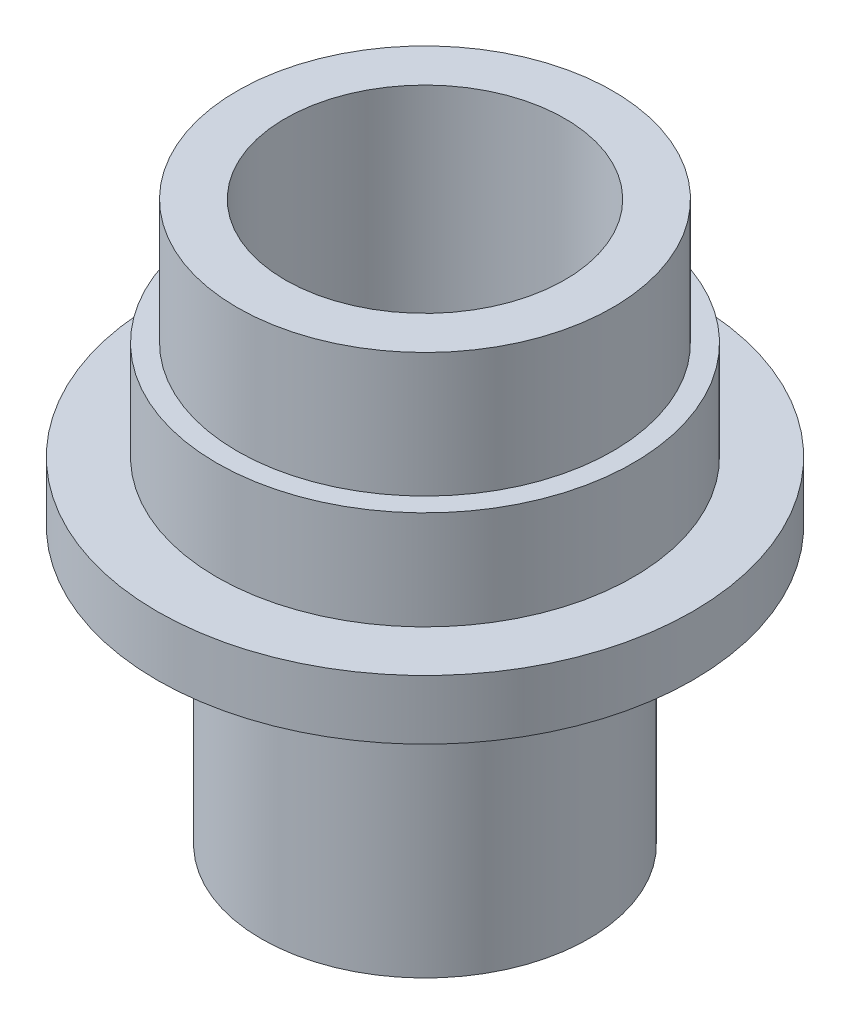
ISO-10303-21;
HEADER;
FILE_DESCRIPTION(('STEP AP214'),'2;1');
FILE_NAME('part.step','',(''),(''),'','','');
FILE_SCHEMA(('AUTOMOTIVE_DESIGN { 1 0 10303 214 1 1 1 1 }'));
ENDSEC;
DATA;
#1=APPLICATION_CONTEXT('core data for automotive mechanical design processes');
#2=APPLICATION_PROTOCOL_DEFINITION('international standard','automotive_design',2000,#1);
#3=PRODUCT_CONTEXT('',#1,'mechanical');
#4=PRODUCT('Part','Part','',(#3));
#5=PRODUCT_RELATED_PRODUCT_CATEGORY('part','',(#4));
#6=PRODUCT_DEFINITION_FORMATION('','',#4);
#7=PRODUCT_DEFINITION_CONTEXT('part definition',#1,'design');
#8=PRODUCT_DEFINITION('design','',#6,#7);
#9=PRODUCT_DEFINITION_SHAPE('','',#8);
#10=(LENGTH_UNIT() NAMED_UNIT(*) SI_UNIT(.MILLI.,.METRE.));
#11=(NAMED_UNIT(*) PLANE_ANGLE_UNIT() SI_UNIT($,.RADIAN.));
#12=(NAMED_UNIT(*) SI_UNIT($,.STERADIAN.) SOLID_ANGLE_UNIT());
#13=UNCERTAINTY_MEASURE_WITH_UNIT(LENGTH_MEASURE(1.E-05),#10,'distance_accuracy_value','');
#14=(GEOMETRIC_REPRESENTATION_CONTEXT(3) GLOBAL_UNCERTAINTY_ASSIGNED_CONTEXT((#13)) GLOBAL_UNIT_ASSIGNED_CONTEXT((#10,
#11,#12)) REPRESENTATION_CONTEXT('',''));
#15=CARTESIAN_POINT('',(0.,0.,0.));
#16=DIRECTION('',(0.,0.,1.));
#17=DIRECTION('',(1.,0.,0.));
#18=AXIS2_PLACEMENT_3D('',#15,#16,#17);
#19=CARTESIAN_POINT('',(0.,0.,0.));
#20=DIRECTION('',(0.,1.,0.));
#21=DIRECTION('',(0.,0.,1.));
#22=AXIS2_PLACEMENT_3D('',#19,#20,#21);
#23=PLANE('',#22);
#24=CARTESIAN_POINT('',(0.,0.,0.));
#25=DIRECTION('',(0.,1.,0.));
#26=DIRECTION('',(0.,0.,1.));
#27=AXIS2_PLACEMENT_3D('',#24,#25,#26);
#28=CIRCLE('',#27,4.69999999999999);
#29=CARTESIAN_POINT('',(0.,0.,4.69999999999999));
#30=VERTEX_POINT('',#29);
#31=EDGE_CURVE('E10',#30,#30,#28,.T.);
#32=ORIENTED_EDGE('',*,*,#31,.T.);
#33=EDGE_LOOP('',(#32));
#34=FACE_BOUND('',#33,.T.);
#35=ADVANCED_FACE('F31',(#34),#23,.T.);
#36=CARTESIAN_POINT('',(0.,46.5849230769231,0.));
#37=DIRECTION('',(0.,1.,0.));
#38=DIRECTION('',(0.,0.,1.));
#39=AXIS2_PLACEMENT_3D('',#36,#37,#38);
#40=CYLINDRICAL_SURFACE('',#39,4.7);
#41=CARTESIAN_POINT('',(0.,9.,0.));
#42=DIRECTION('',(0.,1.,0.));
#43=DIRECTION('',(0.,0.,1.));
#44=AXIS2_PLACEMENT_3D('',#41,#42,#43);
#45=CIRCLE('',#44,4.7);
#46=CARTESIAN_POINT('',(0.,9.,4.7));
#47=VERTEX_POINT('',#46);
#48=EDGE_CURVE('E37',#47,#47,#45,.T.);
#49=ORIENTED_EDGE('',*,*,#48,.T.);
#50=EDGE_LOOP('',(#49));
#51=FACE_BOUND('',#50,.T.);
#52=ORIENTED_EDGE('',*,*,#31,.F.);
#53=EDGE_LOOP('',(#52));
#54=FACE_BOUND('',#53,.T.);
#55=ADVANCED_FACE('F87',(#51,#54),#40,.F.);
#56=CARTESIAN_POINT('',(-4.7,9.,0.));
#57=DIRECTION('',(0.,1.,0.));
#58=DIRECTION('',(0.,0.,1.));
#59=AXIS2_PLACEMENT_3D('',#56,#57,#58);
#60=PLANE('',#59);
#61=CARTESIAN_POINT('',(0.,9.,0.));
#62=DIRECTION('',(0.,1.,0.));
#63=DIRECTION('',(0.,0.,1.));
#64=AXIS2_PLACEMENT_3D('',#61,#62,#63);
#65=CIRCLE('',#64,6.31);
#66=CARTESIAN_POINT('',(0.,9.,6.31));
#67=VERTEX_POINT('',#66);
#68=EDGE_CURVE('E41',#67,#67,#65,.T.);
#69=ORIENTED_EDGE('',*,*,#68,.T.);
#70=EDGE_LOOP('',(#69));
#71=FACE_BOUND('',#70,.T.);
#72=ORIENTED_EDGE('',*,*,#48,.F.);
#73=EDGE_LOOP('',(#72));
#74=FACE_BOUND('',#73,.T.);
#75=ADVANCED_FACE('F91',(#71,#74),#60,.T.);
#76=CARTESIAN_POINT('',(0.,46.5849230769231,0.));
#77=DIRECTION('',(0.,1.,0.));
#78=DIRECTION('',(0.,0.,1.));
#79=AXIS2_PLACEMENT_3D('',#76,#77,#78);
#80=CYLINDRICAL_SURFACE('',#79,6.31);
#81=CARTESIAN_POINT('',(0.,4.82,0.));
#82=DIRECTION('',(0.,1.,0.));
#83=DIRECTION('',(0.,0.,1.));
#84=AXIS2_PLACEMENT_3D('',#81,#82,#83);
#85=CIRCLE('',#84,6.30999999999999);
#86=CARTESIAN_POINT('',(0.,4.82,6.30999999999999));
#87=VERTEX_POINT('',#86);
#88=EDGE_CURVE('E45',#87,#87,#85,.T.);
#89=ORIENTED_EDGE('',*,*,#88,.T.);
#90=EDGE_LOOP('',(#89));
#91=FACE_BOUND('',#90,.T.);
#92=ORIENTED_EDGE('',*,*,#68,.F.);
#93=EDGE_LOOP('',(#92));
#94=FACE_BOUND('',#93,.T.);
#95=ADVANCED_FACE('F95',(#91,#94),#80,.T.);
#96=CARTESIAN_POINT('',(-6.30999999999999,4.82,0.));
#97=DIRECTION('',(0.,1.,0.));
#98=DIRECTION('',(0.,0.,1.));
#99=AXIS2_PLACEMENT_3D('',#96,#97,#98);
#100=PLANE('',#99);
#101=CARTESIAN_POINT('',(0.,4.82,0.));
#102=DIRECTION('',(0.,1.,0.));
#103=DIRECTION('',(0.,0.,1.));
#104=AXIS2_PLACEMENT_3D('',#101,#102,#103);
#105=CIRCLE('',#104,7.);
#106=CARTESIAN_POINT('',(0.,4.82,7.));
#107=VERTEX_POINT('',#106);
#108=EDGE_CURVE('E50',#107,#107,#105,.T.);
#109=ORIENTED_EDGE('',*,*,#108,.T.);
#110=EDGE_LOOP('',(#109));
#111=FACE_BOUND('',#110,.T.);
#112=ORIENTED_EDGE('',*,*,#88,.F.);
#113=EDGE_LOOP('',(#112));
#114=FACE_BOUND('',#113,.T.);
#115=ADVANCED_FACE('F102',(#111,#114),#100,.T.);
#116=CARTESIAN_POINT('',(0.,46.5849230769231,0.));
#117=DIRECTION('',(0.,1.,0.));
#118=DIRECTION('',(0.,0.,1.));
#119=AXIS2_PLACEMENT_3D('',#116,#117,#118);
#120=CYLINDRICAL_SURFACE('',#119,7.);
#121=CARTESIAN_POINT('',(0.,1.5,0.));
#122=DIRECTION('',(0.,1.,0.));
#123=DIRECTION('',(0.,0.,1.));
#124=AXIS2_PLACEMENT_3D('',#121,#122,#123);
#125=CIRCLE('',#124,6.99999999999999);
#126=CARTESIAN_POINT('',(0.,1.5,6.99999999999999));
#127=VERTEX_POINT('',#126);
#128=EDGE_CURVE('E53',#127,#127,#125,.T.);
#129=ORIENTED_EDGE('',*,*,#128,.T.);
#130=EDGE_LOOP('',(#129));
#131=FACE_BOUND('',#130,.T.);
#132=ORIENTED_EDGE('',*,*,#108,.F.);
#133=EDGE_LOOP('',(#132));
#134=FACE_BOUND('',#133,.T.);
#135=ADVANCED_FACE('F106',(#131,#134),#120,.T.);
#136=CARTESIAN_POINT('',(-6.99999999999999,1.5,0.));
#137=DIRECTION('',(0.,1.,0.));
#138=DIRECTION('',(0.,0.,1.));
#139=AXIS2_PLACEMENT_3D('',#136,#137,#138);
#140=PLANE('',#139);
#141=CARTESIAN_POINT('',(0.,1.5,0.));
#142=DIRECTION('',(0.,1.,0.));
#143=DIRECTION('',(0.,0.,1.));
#144=AXIS2_PLACEMENT_3D('',#141,#142,#143);
#145=CIRCLE('',#144,8.99999999999999);
#146=CARTESIAN_POINT('',(0.,1.5,8.99999999999999));
#147=VERTEX_POINT('',#146);
#148=EDGE_CURVE('E56',#147,#147,#145,.T.);
#149=ORIENTED_EDGE('',*,*,#148,.T.);
#150=EDGE_LOOP('',(#149));
#151=FACE_BOUND('',#150,.T.);
#152=ORIENTED_EDGE('',*,*,#128,.F.);
#153=EDGE_LOOP('',(#152));
#154=FACE_BOUND('',#153,.T.);
#155=ADVANCED_FACE('F110',(#151,#154),#140,.T.);
#156=CARTESIAN_POINT('',(0.,46.5849230769231,0.));
#157=DIRECTION('',(0.,1.,0.));
#158=DIRECTION('',(0.,0.,1.));
#159=AXIS2_PLACEMENT_3D('',#156,#157,#158);
#160=CYLINDRICAL_SURFACE('',#159,8.99999999999999);
#161=CARTESIAN_POINT('',(0.,-0.5,0.));
#162=DIRECTION('',(0.,1.,0.));
#163=DIRECTION('',(0.,0.,1.));
#164=AXIS2_PLACEMENT_3D('',#161,#162,#163);
#165=CIRCLE('',#164,9.);
#166=CARTESIAN_POINT('',(0.,-0.5,9.));
#167=VERTEX_POINT('',#166);
#168=EDGE_CURVE('E59',#167,#167,#165,.T.);
#169=ORIENTED_EDGE('',*,*,#168,.T.);
#170=EDGE_LOOP('',(#169));
#171=FACE_BOUND('',#170,.T.);
#172=ORIENTED_EDGE('',*,*,#148,.F.);
#173=EDGE_LOOP('',(#172));
#174=FACE_BOUND('',#173,.T.);
#175=ADVANCED_FACE('F114',(#171,#174),#160,.T.);
#176=CARTESIAN_POINT('',(-9.,-0.5,0.));
#177=DIRECTION('',(0.,-1.,0.));
#178=DIRECTION('',(0.,0.,-1.));
#179=AXIS2_PLACEMENT_3D('',#176,#177,#178);
#180=PLANE('',#179);
#181=CARTESIAN_POINT('',(0.,-0.5,0.));
#182=DIRECTION('',(0.,1.,0.));
#183=DIRECTION('',(0.,0.,1.));
#184=AXIS2_PLACEMENT_3D('',#181,#182,#183);
#185=CIRCLE('',#184,6.99999999999999);
#186=CARTESIAN_POINT('',(0.,-0.5,6.99999999999999));
#187=VERTEX_POINT('',#186);
#188=EDGE_CURVE('E62',#187,#187,#185,.T.);
#189=ORIENTED_EDGE('',*,*,#188,.T.);
#190=EDGE_LOOP('',(#189));
#191=FACE_BOUND('',#190,.T.);
#192=ORIENTED_EDGE('',*,*,#168,.F.);
#193=EDGE_LOOP('',(#192));
#194=FACE_BOUND('',#193,.T.);
#195=ADVANCED_FACE('F118',(#191,#194),#180,.T.);
#196=CARTESIAN_POINT('',(0.,46.5849230769231,0.));
#197=DIRECTION('',(0.,1.,0.));
#198=DIRECTION('',(0.,0.,1.));
#199=AXIS2_PLACEMENT_3D('',#196,#197,#198);
#200=CYLINDRICAL_SURFACE('',#199,6.99999999999999);
#201=CARTESIAN_POINT('',(0.,-1.,0.));
#202=DIRECTION('',(0.,1.,0.));
#203=DIRECTION('',(0.,0.,1.));
#204=AXIS2_PLACEMENT_3D('',#201,#202,#203);
#205=CIRCLE('',#204,6.99999999999999);
#206=CARTESIAN_POINT('',(0.,-1.,6.99999999999999));
#207=VERTEX_POINT('',#206);
#208=EDGE_CURVE('E65',#207,#207,#205,.T.);
#209=ORIENTED_EDGE('',*,*,#208,.T.);
#210=EDGE_LOOP('',(#209));
#211=FACE_BOUND('',#210,.T.);
#212=ORIENTED_EDGE('',*,*,#188,.F.);
#213=EDGE_LOOP('',(#212));
#214=FACE_BOUND('',#213,.T.);
#215=ADVANCED_FACE('F122',(#211,#214),#200,.T.);
#216=CARTESIAN_POINT('',(-6.99999999999999,-1.,0.));
#217=DIRECTION('',(0.,-1.,0.));
#218=DIRECTION('',(0.,0.,-1.));
#219=AXIS2_PLACEMENT_3D('',#216,#217,#218);
#220=PLANE('',#219);
#221=CARTESIAN_POINT('',(0.,-1.,0.));
#222=DIRECTION('',(0.,1.,0.));
#223=DIRECTION('',(0.,0.,1.));
#224=AXIS2_PLACEMENT_3D('',#221,#222,#223);
#225=CIRCLE('',#224,5.49999999999999);
#226=CARTESIAN_POINT('',(0.,-1.,5.49999999999999));
#227=VERTEX_POINT('',#226);
#228=EDGE_CURVE('E68',#227,#227,#225,.T.);
#229=ORIENTED_EDGE('',*,*,#228,.T.);
#230=EDGE_LOOP('',(#229));
#231=FACE_BOUND('',#230,.T.);
#232=ORIENTED_EDGE('',*,*,#208,.F.);
#233=EDGE_LOOP('',(#232));
#234=FACE_BOUND('',#233,.T.);
#235=ADVANCED_FACE('F84',(#231,#234),#220,.T.);
#236=CARTESIAN_POINT('',(0.,46.5849230769231,0.));
#237=DIRECTION('',(0.,1.,0.));
#238=DIRECTION('',(0.,0.,1.));
#239=AXIS2_PLACEMENT_3D('',#236,#237,#238);
#240=CYLINDRICAL_SURFACE('',#239,5.49999999999999);
#241=CARTESIAN_POINT('',(0.,-9.78,0.));
#242=DIRECTION('',(0.,1.,0.));
#243=DIRECTION('',(0.,0.,1.));
#244=AXIS2_PLACEMENT_3D('',#241,#242,#243);
#245=CIRCLE('',#244,5.49999999999999);
#246=CARTESIAN_POINT('',(0.,-9.78,5.49999999999999));
#247=VERTEX_POINT('',#246);
#248=EDGE_CURVE('E71',#247,#247,#245,.T.);
#249=ORIENTED_EDGE('',*,*,#248,.T.);
#250=EDGE_LOOP('',(#249));
#251=FACE_BOUND('',#250,.T.);
#252=ORIENTED_EDGE('',*,*,#228,.F.);
#253=EDGE_LOOP('',(#252));
#254=FACE_BOUND('',#253,.T.);
#255=ADVANCED_FACE('F75',(#251,#254),#240,.T.);
#256=CARTESIAN_POINT('',(-5.49999999999999,-9.78,0.));
#257=DIRECTION('',(0.,-1.,0.));
#258=DIRECTION('',(0.,0.,-1.));
#259=AXIS2_PLACEMENT_3D('',#256,#257,#258);
#260=PLANE('',#259);
#261=ORIENTED_EDGE('',*,*,#248,.F.);
#262=EDGE_LOOP('',(#261));
#263=FACE_BOUND('',#262,.T.);
#264=ADVANCED_FACE('F78',(#263),#260,.T.);
#265=CLOSED_SHELL('',(#35,#55,#75,#95,#115,#135,#155,#175,#195,#215,#235,#255,#264));
#266=MANIFOLD_SOLID_BREP('B2',#265);
#267=ADVANCED_BREP_SHAPE_REPRESENTATION('',(#18,#266),#14);
#268=SHAPE_DEFINITION_REPRESENTATION(#9,#267);
ENDSEC;
END-ISO-10303-21;
